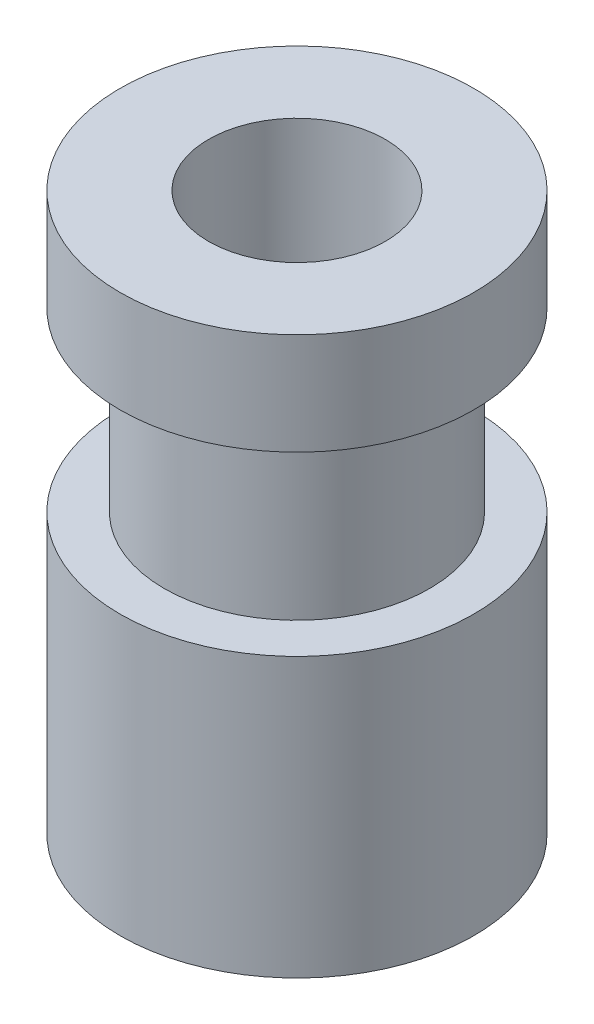
ISO-10303-21;
HEADER;
FILE_DESCRIPTION(('STEP AP214'),'2;1');
FILE_NAME('part.step','',(''),(''),'','','');
FILE_SCHEMA(('AUTOMOTIVE_DESIGN { 1 0 10303 214 1 1 1 1 }'));
ENDSEC;
DATA;
#1=APPLICATION_CONTEXT('core data for automotive mechanical design processes');
#2=APPLICATION_PROTOCOL_DEFINITION('international standard','automotive_design',2000,#1);
#3=PRODUCT_CONTEXT('',#1,'mechanical');
#4=PRODUCT('Part','Part','',(#3));
#5=PRODUCT_RELATED_PRODUCT_CATEGORY('part','',(#4));
#6=PRODUCT_DEFINITION_FORMATION('','',#4);
#7=PRODUCT_DEFINITION_CONTEXT('part definition',#1,'design');
#8=PRODUCT_DEFINITION('design','',#6,#7);
#9=PRODUCT_DEFINITION_SHAPE('','',#8);
#10=(LENGTH_UNIT() NAMED_UNIT(*) SI_UNIT(.MILLI.,.METRE.));
#11=(NAMED_UNIT(*) PLANE_ANGLE_UNIT() SI_UNIT($,.RADIAN.));
#12=(NAMED_UNIT(*) SI_UNIT($,.STERADIAN.) SOLID_ANGLE_UNIT());
#13=UNCERTAINTY_MEASURE_WITH_UNIT(LENGTH_MEASURE(1.E-05),#10,'distance_accuracy_value','');
#14=(GEOMETRIC_REPRESENTATION_CONTEXT(3) GLOBAL_UNCERTAINTY_ASSIGNED_CONTEXT((#13)) GLOBAL_UNIT_ASSIGNED_CONTEXT((#10,
#11,#12)) REPRESENTATION_CONTEXT('',''));
#15=CARTESIAN_POINT('',(0.,0.,0.));
#16=DIRECTION('',(0.,0.,1.));
#17=DIRECTION('',(1.,0.,0.));
#18=AXIS2_PLACEMENT_3D('',#15,#16,#17);
#19=CARTESIAN_POINT('',(0.,15.75,0.));
#20=DIRECTION('',(0.,1.,0.));
#21=DIRECTION('',(0.,0.,1.));
#22=AXIS2_PLACEMENT_3D('',#19,#20,#21);
#23=PLANE('',#22);
#24=CARTESIAN_POINT('',(0.,15.75,0.));
#25=DIRECTION('',(0.,1.,0.));
#26=DIRECTION('',(0.,0.,1.));
#27=AXIS2_PLACEMENT_3D('',#24,#25,#26);
#28=CIRCLE('',#27,10.);
#29=CARTESIAN_POINT('',(0.,15.75,10.));
#30=VERTEX_POINT('',#29);
#31=EDGE_CURVE('E40',#30,#30,#28,.T.);
#32=ORIENTED_EDGE('',*,*,#31,.T.);
#33=EDGE_LOOP('',(#32));
#34=FACE_BOUND('',#33,.T.);
#35=CARTESIAN_POINT('',(0.,15.75,0.));
#36=DIRECTION('',(0.,1.,0.));
#37=DIRECTION('',(0.,0.,1.));
#38=AXIS2_PLACEMENT_3D('',#35,#36,#37);
#39=CIRCLE('',#38,7.5);
#40=CARTESIAN_POINT('',(0.,15.75,7.5));
#41=VERTEX_POINT('',#40);
#42=EDGE_CURVE('E53',#41,#41,#39,.T.);
#43=ORIENTED_EDGE('',*,*,#42,.F.);
#44=EDGE_LOOP('',(#43));
#45=FACE_BOUND('',#44,.T.);
#46=ADVANCED_FACE('F29',(#34,#45),#23,.T.);
#47=CARTESIAN_POINT('',(0.,10.,0.));
#48=DIRECTION('',(0.,-1.,0.));
#49=DIRECTION('',(0.,0.,-1.));
#50=AXIS2_PLACEMENT_3D('',#47,#48,#49);
#51=CYLINDRICAL_SURFACE('',#50,10.);
#52=CARTESIAN_POINT('',(0.,0.,0.));
#53=DIRECTION('',(0.,1.,0.));
#54=DIRECTION('',(0.,0.,1.));
#55=AXIS2_PLACEMENT_3D('',#52,#53,#54);
#56=CIRCLE('',#55,10.);
#57=CARTESIAN_POINT('',(0.,0.,10.));
#58=VERTEX_POINT('',#57);
#59=EDGE_CURVE('E10',#58,#58,#56,.T.);
#60=ORIENTED_EDGE('',*,*,#59,.T.);
#61=EDGE_LOOP('',(#60));
#62=FACE_BOUND('',#61,.T.);
#63=ORIENTED_EDGE('',*,*,#31,.F.);
#64=EDGE_LOOP('',(#63));
#65=FACE_BOUND('',#64,.T.);
#66=ADVANCED_FACE('F31',(#62,#65),#51,.T.);
#67=CARTESIAN_POINT('',(0.,0.,0.));
#68=DIRECTION('',(0.,1.,0.));
#69=DIRECTION('',(0.,0.,1.));
#70=AXIS2_PLACEMENT_3D('',#67,#68,#69);
#71=PLANE('',#70);
#72=CARTESIAN_POINT('',(0.,0.,0.));
#73=DIRECTION('',(0.,1.,0.));
#74=DIRECTION('',(0.,0.,1.));
#75=AXIS2_PLACEMENT_3D('',#72,#73,#74);
#76=CIRCLE('',#75,1.5);
#77=CARTESIAN_POINT('',(0.,0.,1.5));
#78=VERTEX_POINT('',#77);
#79=EDGE_CURVE('E36',#78,#78,#76,.F.);
#80=ORIENTED_EDGE('',*,*,#79,.F.);
#81=EDGE_LOOP('',(#80));
#82=FACE_BOUND('',#81,.T.);
#83=ORIENTED_EDGE('',*,*,#59,.F.);
#84=EDGE_LOOP('',(#83));
#85=FACE_BOUND('',#84,.T.);
#86=ADVANCED_FACE('F100',(#82,#85),#71,.F.);
#87=CARTESIAN_POINT('',(0.,-0.000999999999999265,0.));
#88=DIRECTION('',(0.,1.,0.));
#89=DIRECTION('',(0.,0.,1.));
#90=AXIS2_PLACEMENT_3D('',#87,#88,#89);
#91=CYLINDRICAL_SURFACE('',#90,1.5);
#92=CARTESIAN_POINT('',(0.,10.,0.));
#93=DIRECTION('',(0.,1.,0.));
#94=DIRECTION('',(0.,0.,1.));
#95=AXIS2_PLACEMENT_3D('',#92,#93,#94);
#96=CIRCLE('',#95,1.5);
#97=CARTESIAN_POINT('',(0.,10.,1.5));
#98=VERTEX_POINT('',#97);
#99=EDGE_CURVE('E44',#98,#98,#96,.F.);
#100=ORIENTED_EDGE('',*,*,#99,.F.);
#101=EDGE_LOOP('',(#100));
#102=FACE_BOUND('',#101,.T.);
#103=ORIENTED_EDGE('',*,*,#79,.T.);
#104=EDGE_LOOP('',(#103));
#105=FACE_BOUND('',#104,.T.);
#106=ADVANCED_FACE('F104',(#102,#105),#91,.F.);
#107=CARTESIAN_POINT('',(0.,10.,0.));
#108=DIRECTION('',(0.,1.,0.));
#109=DIRECTION('',(0.,0.,1.));
#110=AXIS2_PLACEMENT_3D('',#107,#108,#109);
#111=PLANE('',#110);
#112=CARTESIAN_POINT('',(0.,10.,0.));
#113=DIRECTION('',(0.,1.,0.));
#114=DIRECTION('',(0.,0.,1.));
#115=AXIS2_PLACEMENT_3D('',#112,#113,#114);
#116=CIRCLE('',#115,5.);
#117=CARTESIAN_POINT('',(0.,10.,5.));
#118=VERTEX_POINT('',#117);
#119=EDGE_CURVE('E49',#118,#118,#116,.T.);
#120=ORIENTED_EDGE('',*,*,#119,.T.);
#121=EDGE_LOOP('',(#120));
#122=FACE_BOUND('',#121,.T.);
#123=ORIENTED_EDGE('',*,*,#99,.T.);
#124=EDGE_LOOP('',(#123));
#125=FACE_BOUND('',#124,.T.);
#126=ADVANCED_FACE('F106',(#122,#125),#111,.T.);
#127=CARTESIAN_POINT('',(0.,10.,0.));
#128=DIRECTION('',(0.,1.,0.));
#129=DIRECTION('',(0.,0.,1.));
#130=AXIS2_PLACEMENT_3D('',#127,#128,#129);
#131=CYLINDRICAL_SURFACE('',#130,5.);
#132=ORIENTED_EDGE('',*,*,#119,.F.);
#133=EDGE_LOOP('',(#132));
#134=FACE_BOUND('',#133,.T.);
#135=CARTESIAN_POINT('',(0.,31.5,0.));
#136=DIRECTION('',(0.,1.,0.));
#137=DIRECTION('',(0.,0.,1.));
#138=AXIS2_PLACEMENT_3D('',#135,#136,#137);
#139=CIRCLE('',#138,5.);
#140=CARTESIAN_POINT('',(0.,31.5,5.));
#141=VERTEX_POINT('',#140);
#142=EDGE_CURVE('E62',#141,#141,#139,.T.);
#143=ORIENTED_EDGE('',*,*,#142,.T.);
#144=EDGE_LOOP('',(#143));
#145=FACE_BOUND('',#144,.T.);
#146=ADVANCED_FACE('F68',(#134,#145),#131,.F.);
#147=CARTESIAN_POINT('',(0.,25.75,0.));
#148=DIRECTION('',(0.,-1.,0.));
#149=DIRECTION('',(0.,0.,-1.));
#150=AXIS2_PLACEMENT_3D('',#147,#148,#149);
#151=CYLINDRICAL_SURFACE('',#150,7.5);
#152=CARTESIAN_POINT('',(0.,25.75,0.));
#153=DIRECTION('',(0.,1.,0.));
#154=DIRECTION('',(0.,0.,1.));
#155=AXIS2_PLACEMENT_3D('',#152,#153,#154);
#156=CIRCLE('',#155,7.5);
#157=CARTESIAN_POINT('',(0.,25.75,7.5));
#158=VERTEX_POINT('',#157);
#159=EDGE_CURVE('E52',#158,#158,#156,.T.);
#160=ORIENTED_EDGE('',*,*,#159,.F.);
#161=EDGE_LOOP('',(#160));
#162=FACE_BOUND('',#161,.T.);
#163=ORIENTED_EDGE('',*,*,#42,.T.);
#164=EDGE_LOOP('',(#163));
#165=FACE_BOUND('',#164,.T.);
#166=ADVANCED_FACE('F85',(#162,#165),#151,.T.);
#167=CARTESIAN_POINT('',(0.,25.75,0.));
#168=DIRECTION('',(0.,1.,0.));
#169=DIRECTION('',(0.,0.,1.));
#170=AXIS2_PLACEMENT_3D('',#167,#168,#169);
#171=PLANE('',#170);
#172=CARTESIAN_POINT('',(0.,25.75,0.));
#173=DIRECTION('',(0.,1.,0.));
#174=DIRECTION('',(0.,0.,1.));
#175=AXIS2_PLACEMENT_3D('',#172,#173,#174);
#176=CIRCLE('',#175,10.);
#177=CARTESIAN_POINT('',(0.,25.75,10.));
#178=VERTEX_POINT('',#177);
#179=EDGE_CURVE('E59',#178,#178,#176,.T.);
#180=ORIENTED_EDGE('',*,*,#179,.F.);
#181=EDGE_LOOP('',(#180));
#182=FACE_BOUND('',#181,.T.);
#183=ORIENTED_EDGE('',*,*,#159,.T.);
#184=EDGE_LOOP('',(#183));
#185=FACE_BOUND('',#184,.T.);
#186=ADVANCED_FACE('F79',(#182,#185),#171,.F.);
#187=CARTESIAN_POINT('',(0.,31.5,0.));
#188=DIRECTION('',(0.,-1.,0.));
#189=DIRECTION('',(0.,0.,-1.));
#190=AXIS2_PLACEMENT_3D('',#187,#188,#189);
#191=CYLINDRICAL_SURFACE('',#190,10.);
#192=CARTESIAN_POINT('',(0.,31.5,0.));
#193=DIRECTION('',(0.,1.,0.));
#194=DIRECTION('',(0.,0.,1.));
#195=AXIS2_PLACEMENT_3D('',#192,#193,#194);
#196=CIRCLE('',#195,10.);
#197=CARTESIAN_POINT('',(0.,31.5,10.));
#198=VERTEX_POINT('',#197);
#199=EDGE_CURVE('E56',#198,#198,#196,.T.);
#200=ORIENTED_EDGE('',*,*,#199,.F.);
#201=EDGE_LOOP('',(#200));
#202=FACE_BOUND('',#201,.T.);
#203=ORIENTED_EDGE('',*,*,#179,.T.);
#204=EDGE_LOOP('',(#203));
#205=FACE_BOUND('',#204,.T.);
#206=ADVANCED_FACE('F73',(#202,#205),#191,.T.);
#207=CARTESIAN_POINT('',(0.,31.5,0.));
#208=DIRECTION('',(0.,1.,0.));
#209=DIRECTION('',(0.,0.,1.));
#210=AXIS2_PLACEMENT_3D('',#207,#208,#209);
#211=PLANE('',#210);
#212=ORIENTED_EDGE('',*,*,#142,.F.);
#213=EDGE_LOOP('',(#212));
#214=FACE_BOUND('',#213,.T.);
#215=ORIENTED_EDGE('',*,*,#199,.T.);
#216=EDGE_LOOP('',(#215));
#217=FACE_BOUND('',#216,.T.);
#218=ADVANCED_FACE('F70',(#214,#217),#211,.T.);
#219=CLOSED_SHELL('',(#46,#66,#86,#106,#126,#146,#166,#186,#206,#218));
#220=MANIFOLD_SOLID_BREP('B2',#219);
#221=ADVANCED_BREP_SHAPE_REPRESENTATION('',(#18,#220),#14);
#222=SHAPE_DEFINITION_REPRESENTATION(#9,#221);
ENDSEC;
END-ISO-10303-21;
